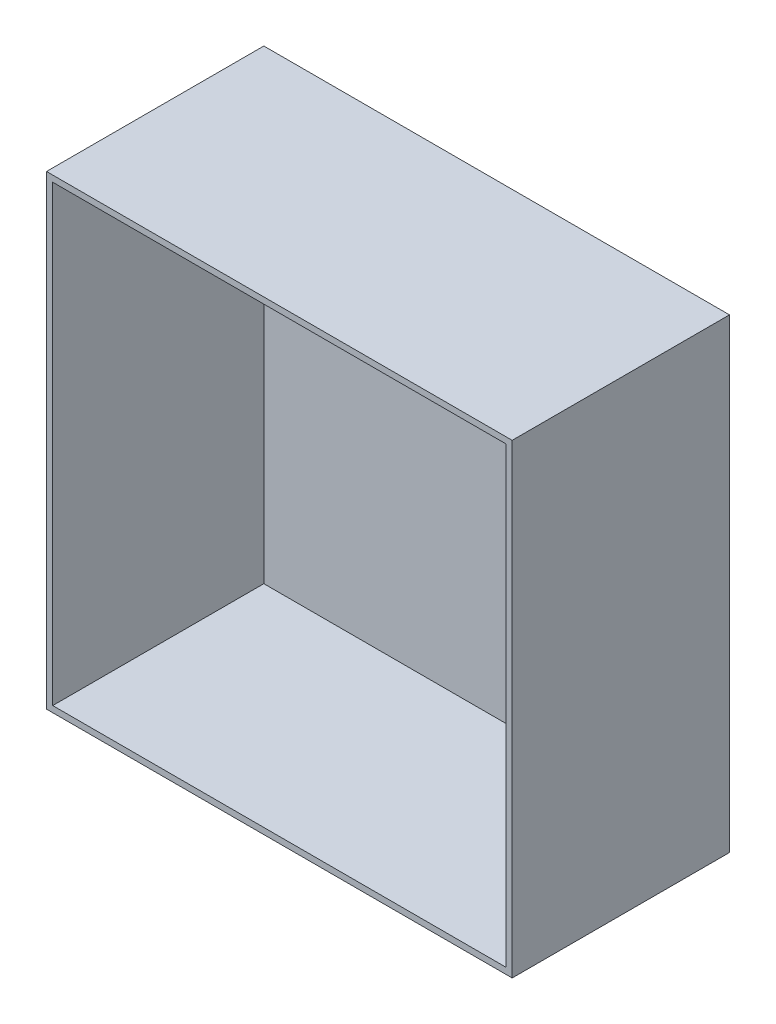
ISO-10303-21;
HEADER;
FILE_DESCRIPTION(('STEP AP214'),'2;1');
FILE_NAME('part.step','',(''),(''),'','','');
FILE_SCHEMA(('AUTOMOTIVE_DESIGN { 1 0 10303 214 1 1 1 1 }'));
ENDSEC;
DATA;
#1=APPLICATION_CONTEXT('core data for automotive mechanical design processes');
#2=APPLICATION_PROTOCOL_DEFINITION('international standard','automotive_design',2000,#1);
#3=PRODUCT_CONTEXT('',#1,'mechanical');
#4=PRODUCT('Part','Part','',(#3));
#5=PRODUCT_RELATED_PRODUCT_CATEGORY('part','',(#4));
#6=PRODUCT_DEFINITION_FORMATION('','',#4);
#7=PRODUCT_DEFINITION_CONTEXT('part definition',#1,'design');
#8=PRODUCT_DEFINITION('design','',#6,#7);
#9=PRODUCT_DEFINITION_SHAPE('','',#8);
#10=(LENGTH_UNIT() NAMED_UNIT(*) SI_UNIT(.MILLI.,.METRE.));
#11=(NAMED_UNIT(*) PLANE_ANGLE_UNIT() SI_UNIT($,.RADIAN.));
#12=(NAMED_UNIT(*) SI_UNIT($,.STERADIAN.) SOLID_ANGLE_UNIT());
#13=UNCERTAINTY_MEASURE_WITH_UNIT(LENGTH_MEASURE(1.E-05),#10,'distance_accuracy_value','');
#14=(GEOMETRIC_REPRESENTATION_CONTEXT(3) GLOBAL_UNCERTAINTY_ASSIGNED_CONTEXT((#13)) GLOBAL_UNIT_ASSIGNED_CONTEXT((#10,
#11,#12)) REPRESENTATION_CONTEXT('',''));
#15=CARTESIAN_POINT('',(0.,0.,0.));
#16=DIRECTION('',(0.,0.,1.));
#17=DIRECTION('',(1.,0.,0.));
#18=AXIS2_PLACEMENT_3D('',#15,#16,#17);
#19=CARTESIAN_POINT('',(0.,0.,70.));
#20=DIRECTION('',(1.,0.,0.));
#21=DIRECTION('',(0.,1.,0.));
#22=AXIS2_PLACEMENT_3D('',#19,#20,#21);
#23=PLANE('',#22);
#24=DIRECTION('',(0.,-1.,0.));
#25=VECTOR('',#24,1.);
#26=CARTESIAN_POINT('',(0.,0.,0.));
#27=LINE('',#26,#25);
#28=CARTESIAN_POINT('',(0.,0.,0.));
#29=VERTEX_POINT('',#28);
#30=CARTESIAN_POINT('',(0.,-150.,0.));
#31=VERTEX_POINT('',#30);
#32=EDGE_CURVE('E150',#29,#31,#27,.T.);
#33=ORIENTED_EDGE('',*,*,#32,.T.);
#34=DIRECTION('',(0.,0.,-1.));
#35=VECTOR('',#34,1.);
#36=CARTESIAN_POINT('',(0.,-150.,70.));
#37=LINE('',#36,#35);
#38=CARTESIAN_POINT('',(0.,-150.,70.));
#39=VERTEX_POINT('',#38);
#40=EDGE_CURVE('E11',#39,#31,#37,.T.);
#41=ORIENTED_EDGE('',*,*,#40,.F.);
#42=DIRECTION('',(0.,-1.,0.));
#43=VECTOR('',#42,1.);
#44=CARTESIAN_POINT('',(0.,0.,70.));
#45=LINE('',#44,#43);
#46=CARTESIAN_POINT('',(0.,0.,70.));
#47=VERTEX_POINT('',#46);
#48=EDGE_CURVE('E153',#47,#39,#45,.T.);
#49=ORIENTED_EDGE('',*,*,#48,.F.);
#50=DIRECTION('',(0.,0.,-1.));
#51=VECTOR('',#50,1.);
#52=CARTESIAN_POINT('',(0.,0.,70.));
#53=LINE('',#52,#51);
#54=EDGE_CURVE('E160',#47,#29,#53,.T.);
#55=ORIENTED_EDGE('',*,*,#54,.T.);
#56=EDGE_LOOP('',(#33,#41,#49,#55));
#57=FACE_BOUND('',#56,.T.);
#58=ADVANCED_FACE('F39',(#57),#23,.F.);
#59=CARTESIAN_POINT('',(0.,-150.,70.));
#60=DIRECTION('',(0.,1.,0.));
#61=DIRECTION('',(0.,0.,1.));
#62=AXIS2_PLACEMENT_3D('',#59,#60,#61);
#63=PLANE('',#62);
#64=DIRECTION('',(1.,0.,0.));
#65=VECTOR('',#64,1.);
#66=CARTESIAN_POINT('',(0.,-150.,0.));
#67=LINE('',#66,#65);
#68=CARTESIAN_POINT('',(150.,-150.,0.));
#69=VERTEX_POINT('',#68);
#70=EDGE_CURVE('E158',#31,#69,#67,.T.);
#71=ORIENTED_EDGE('',*,*,#70,.T.);
#72=DIRECTION('',(0.,0.,-1.));
#73=VECTOR('',#72,1.);
#74=CARTESIAN_POINT('',(150.,-150.,70.));
#75=LINE('',#74,#73);
#76=CARTESIAN_POINT('',(150.,-150.,70.));
#77=VERTEX_POINT('',#76);
#78=EDGE_CURVE('E46',#77,#69,#75,.T.);
#79=ORIENTED_EDGE('',*,*,#78,.F.);
#80=DIRECTION('',(1.,0.,0.));
#81=VECTOR('',#80,1.);
#82=CARTESIAN_POINT('',(0.,-150.,70.));
#83=LINE('',#82,#81);
#84=EDGE_CURVE('E89',#39,#77,#83,.T.);
#85=ORIENTED_EDGE('',*,*,#84,.F.);
#86=ORIENTED_EDGE('',*,*,#40,.T.);
#87=EDGE_LOOP('',(#71,#79,#85,#86));
#88=FACE_BOUND('',#87,.T.);
#89=ADVANCED_FACE('F189',(#88),#63,.F.);
#90=CARTESIAN_POINT('',(150.,0.,70.));
#91=DIRECTION('',(-1.,0.,0.));
#92=DIRECTION('',(0.,-1.,0.));
#93=AXIS2_PLACEMENT_3D('',#90,#91,#92);
#94=PLANE('',#93);
#95=DIRECTION('',(0.,1.,0.));
#96=VECTOR('',#95,1.);
#97=CARTESIAN_POINT('',(150.,0.,0.));
#98=LINE('',#97,#96);
#99=CARTESIAN_POINT('',(150.,0.,0.));
#100=VERTEX_POINT('',#99);
#101=EDGE_CURVE('E165',#69,#100,#98,.T.);
#102=ORIENTED_EDGE('',*,*,#101,.T.);
#103=DIRECTION('',(0.,0.,-1.));
#104=VECTOR('',#103,1.);
#105=CARTESIAN_POINT('',(150.,0.,70.));
#106=LINE('',#105,#104);
#107=CARTESIAN_POINT('',(150.,0.,70.));
#108=VERTEX_POINT('',#107);
#109=EDGE_CURVE('E168',#108,#100,#106,.T.);
#110=ORIENTED_EDGE('',*,*,#109,.F.);
#111=DIRECTION('',(0.,1.,0.));
#112=VECTOR('',#111,1.);
#113=CARTESIAN_POINT('',(150.,0.,70.));
#114=LINE('',#113,#112);
#115=EDGE_CURVE('E152',#77,#108,#114,.T.);
#116=ORIENTED_EDGE('',*,*,#115,.F.);
#117=ORIENTED_EDGE('',*,*,#78,.T.);
#118=EDGE_LOOP('',(#102,#110,#116,#117));
#119=FACE_BOUND('',#118,.T.);
#120=ADVANCED_FACE('F173',(#119),#94,.F.);
#121=CARTESIAN_POINT('',(0.,0.,70.));
#122=DIRECTION('',(0.,-1.,0.));
#123=DIRECTION('',(0.,0.,-1.));
#124=AXIS2_PLACEMENT_3D('',#121,#122,#123);
#125=PLANE('',#124);
#126=DIRECTION('',(-1.,0.,0.));
#127=VECTOR('',#126,1.);
#128=CARTESIAN_POINT('',(0.,0.,0.));
#129=LINE('',#128,#127);
#130=EDGE_CURVE('E81',#100,#29,#129,.T.);
#131=ORIENTED_EDGE('',*,*,#130,.T.);
#132=ORIENTED_EDGE('',*,*,#54,.F.);
#133=DIRECTION('',(-1.,0.,0.));
#134=VECTOR('',#133,1.);
#135=CARTESIAN_POINT('',(0.,0.,70.));
#136=LINE('',#135,#134);
#137=EDGE_CURVE('E65',#108,#47,#136,.T.);
#138=ORIENTED_EDGE('',*,*,#137,.F.);
#139=ORIENTED_EDGE('',*,*,#109,.T.);
#140=EDGE_LOOP('',(#131,#132,#138,#139));
#141=FACE_BOUND('',#140,.T.);
#142=ADVANCED_FACE('F177',(#141),#125,.F.);
#143=CARTESIAN_POINT('',(0.,0.,70.));
#144=DIRECTION('',(0.,0.,1.));
#145=DIRECTION('',(1.,0.,0.));
#146=AXIS2_PLACEMENT_3D('',#143,#144,#145);
#147=PLANE('',#146);
#148=DIRECTION('',(0.,-1.,0.));
#149=VECTOR('',#148,1.);
#150=CARTESIAN_POINT('',(2.,-2.,70.));
#151=LINE('',#150,#149);
#152=CARTESIAN_POINT('',(2.,-2.,70.));
#153=VERTEX_POINT('',#152);
#154=CARTESIAN_POINT('',(2.00000000000002,-148.,70.));
#155=VERTEX_POINT('',#154);
#156=EDGE_CURVE('E52',#153,#155,#151,.T.);
#157=ORIENTED_EDGE('',*,*,#156,.F.);
#158=DIRECTION('',(-1.,0.,0.));
#159=VECTOR('',#158,1.);
#160=CARTESIAN_POINT('',(2.,-2.,70.));
#161=LINE('',#160,#159);
#162=CARTESIAN_POINT('',(148.,-2.,70.));
#163=VERTEX_POINT('',#162);
#164=EDGE_CURVE('E135',#163,#153,#161,.T.);
#165=ORIENTED_EDGE('',*,*,#164,.F.);
#166=DIRECTION('',(0.,1.,0.));
#167=VECTOR('',#166,1.);
#168=CARTESIAN_POINT('',(148.,-2.,70.));
#169=LINE('',#168,#167);
#170=CARTESIAN_POINT('',(148.,-148.,70.));
#171=VERTEX_POINT('',#170);
#172=EDGE_CURVE('E134',#171,#163,#169,.T.);
#173=ORIENTED_EDGE('',*,*,#172,.F.);
#174=DIRECTION('',(1.,0.,0.));
#175=VECTOR('',#174,1.);
#176=CARTESIAN_POINT('',(2.00000000000002,-148.,70.));
#177=LINE('',#176,#175);
#178=EDGE_CURVE('E141',#155,#171,#177,.T.);
#179=ORIENTED_EDGE('',*,*,#178,.F.);
#180=EDGE_LOOP('',(#157,#165,#173,#179));
#181=FACE_BOUND('',#180,.T.);
#182=ORIENTED_EDGE('',*,*,#48,.T.);
#183=ORIENTED_EDGE('',*,*,#84,.T.);
#184=ORIENTED_EDGE('',*,*,#115,.T.);
#185=ORIENTED_EDGE('',*,*,#137,.T.);
#186=EDGE_LOOP('',(#182,#183,#184,#185));
#187=FACE_BOUND('',#186,.T.);
#188=ADVANCED_FACE('F181',(#181,#187),#147,.T.);
#189=CARTESIAN_POINT('',(0.,0.,0.));
#190=DIRECTION('',(0.,0.,1.));
#191=DIRECTION('',(1.,0.,0.));
#192=AXIS2_PLACEMENT_3D('',#189,#190,#191);
#193=PLANE('',#192);
#194=ORIENTED_EDGE('',*,*,#32,.F.);
#195=ORIENTED_EDGE('',*,*,#130,.F.);
#196=ORIENTED_EDGE('',*,*,#101,.F.);
#197=ORIENTED_EDGE('',*,*,#70,.F.);
#198=EDGE_LOOP('',(#194,#195,#196,#197));
#199=FACE_BOUND('',#198,.T.);
#200=ADVANCED_FACE('F172',(#199),#193,.F.);
#201=CARTESIAN_POINT('',(2.,-2.,2.));
#202=DIRECTION('',(-1.,0.,0.));
#203=DIRECTION('',(0.,-1.,0.));
#204=AXIS2_PLACEMENT_3D('',#201,#202,#203);
#205=PLANE('',#204);
#206=ORIENTED_EDGE('',*,*,#156,.T.);
#207=DIRECTION('',(0.,0.,1.));
#208=VECTOR('',#207,1.);
#209=CARTESIAN_POINT('',(2.00000000000002,-148.,2.));
#210=LINE('',#209,#208);
#211=CARTESIAN_POINT('',(2.00000000000002,-148.,2.));
#212=VERTEX_POINT('',#211);
#213=EDGE_CURVE('E109',#212,#155,#210,.T.);
#214=ORIENTED_EDGE('',*,*,#213,.F.);
#215=DIRECTION('',(0.,-1.,0.));
#216=VECTOR('',#215,1.);
#217=CARTESIAN_POINT('',(2.,-2.,2.));
#218=LINE('',#217,#216);
#219=CARTESIAN_POINT('',(2.,-2.,2.));
#220=VERTEX_POINT('',#219);
#221=EDGE_CURVE('E114',#220,#212,#218,.T.);
#222=ORIENTED_EDGE('',*,*,#221,.F.);
#223=DIRECTION('',(0.,0.,1.));
#224=VECTOR('',#223,1.);
#225=CARTESIAN_POINT('',(2.,-2.,2.));
#226=LINE('',#225,#224);
#227=EDGE_CURVE('E144',#220,#153,#226,.T.);
#228=ORIENTED_EDGE('',*,*,#227,.T.);
#229=EDGE_LOOP('',(#206,#214,#222,#228));
#230=FACE_BOUND('',#229,.T.);
#231=ADVANCED_FACE('F115',(#230),#205,.F.);
#232=CARTESIAN_POINT('',(2.,-2.,2.));
#233=DIRECTION('',(0.,1.,0.));
#234=DIRECTION('',(0.,0.,1.));
#235=AXIS2_PLACEMENT_3D('',#232,#233,#234);
#236=PLANE('',#235);
#237=ORIENTED_EDGE('',*,*,#164,.T.);
#238=ORIENTED_EDGE('',*,*,#227,.F.);
#239=DIRECTION('',(-1.,0.,0.));
#240=VECTOR('',#239,1.);
#241=CARTESIAN_POINT('',(2.,-2.,2.));
#242=LINE('',#241,#240);
#243=CARTESIAN_POINT('',(148.,-2.,2.));
#244=VERTEX_POINT('',#243);
#245=EDGE_CURVE('E119',#244,#220,#242,.T.);
#246=ORIENTED_EDGE('',*,*,#245,.F.);
#247=DIRECTION('',(0.,0.,1.));
#248=VECTOR('',#247,1.);
#249=CARTESIAN_POINT('',(148.,-2.,2.));
#250=LINE('',#249,#248);
#251=EDGE_CURVE('E149',#244,#163,#250,.T.);
#252=ORIENTED_EDGE('',*,*,#251,.T.);
#253=EDGE_LOOP('',(#237,#238,#246,#252));
#254=FACE_BOUND('',#253,.T.);
#255=ADVANCED_FACE('F229',(#254),#236,.F.);
#256=CARTESIAN_POINT('',(148.,-2.,2.));
#257=DIRECTION('',(1.,0.,0.));
#258=DIRECTION('',(0.,1.,0.));
#259=AXIS2_PLACEMENT_3D('',#256,#257,#258);
#260=PLANE('',#259);
#261=ORIENTED_EDGE('',*,*,#172,.T.);
#262=ORIENTED_EDGE('',*,*,#251,.F.);
#263=DIRECTION('',(0.,1.,0.));
#264=VECTOR('',#263,1.);
#265=CARTESIAN_POINT('',(148.,-2.,2.));
#266=LINE('',#265,#264);
#267=CARTESIAN_POINT('',(148.,-148.,2.));
#268=VERTEX_POINT('',#267);
#269=EDGE_CURVE('E126',#268,#244,#266,.T.);
#270=ORIENTED_EDGE('',*,*,#269,.F.);
#271=DIRECTION('',(0.,0.,1.));
#272=VECTOR('',#271,1.);
#273=CARTESIAN_POINT('',(148.,-148.,2.));
#274=LINE('',#273,#272);
#275=EDGE_CURVE('E117',#268,#171,#274,.T.);
#276=ORIENTED_EDGE('',*,*,#275,.T.);
#277=EDGE_LOOP('',(#261,#262,#270,#276));
#278=FACE_BOUND('',#277,.T.);
#279=ADVANCED_FACE('F236',(#278),#260,.F.);
#280=CARTESIAN_POINT('',(2.00000000000002,-148.,2.));
#281=DIRECTION('',(0.,-1.,0.));
#282=DIRECTION('',(0.,0.,-1.));
#283=AXIS2_PLACEMENT_3D('',#280,#281,#282);
#284=PLANE('',#283);
#285=ORIENTED_EDGE('',*,*,#178,.T.);
#286=ORIENTED_EDGE('',*,*,#275,.F.);
#287=DIRECTION('',(1.,0.,0.));
#288=VECTOR('',#287,1.);
#289=CARTESIAN_POINT('',(2.00000000000002,-148.,2.));
#290=LINE('',#289,#288);
#291=EDGE_CURVE('E121',#212,#268,#290,.T.);
#292=ORIENTED_EDGE('',*,*,#291,.F.);
#293=ORIENTED_EDGE('',*,*,#213,.T.);
#294=EDGE_LOOP('',(#285,#286,#292,#293));
#295=FACE_BOUND('',#294,.T.);
#296=ADVANCED_FACE('F125',(#295),#284,.F.);
#297=CARTESIAN_POINT('',(0.,0.,2.));
#298=DIRECTION('',(0.,0.,1.));
#299=DIRECTION('',(1.,0.,0.));
#300=AXIS2_PLACEMENT_3D('',#297,#298,#299);
#301=PLANE('',#300);
#302=ORIENTED_EDGE('',*,*,#221,.T.);
#303=ORIENTED_EDGE('',*,*,#291,.T.);
#304=ORIENTED_EDGE('',*,*,#269,.T.);
#305=ORIENTED_EDGE('',*,*,#245,.T.);
#306=EDGE_LOOP('',(#302,#303,#304,#305));
#307=FACE_BOUND('',#306,.T.);
#308=ADVANCED_FACE('F127',(#307),#301,.T.);
#309=CLOSED_SHELL('',(#58,#89,#120,#142,#188,#200,#231,#255,#279,#296,#308));
#310=MANIFOLD_SOLID_BREP('B2',#309);
#311=ADVANCED_BREP_SHAPE_REPRESENTATION('',(#18,#310),#14);
#312=SHAPE_DEFINITION_REPRESENTATION(#9,#311);
ENDSEC;
END-ISO-10303-21;
